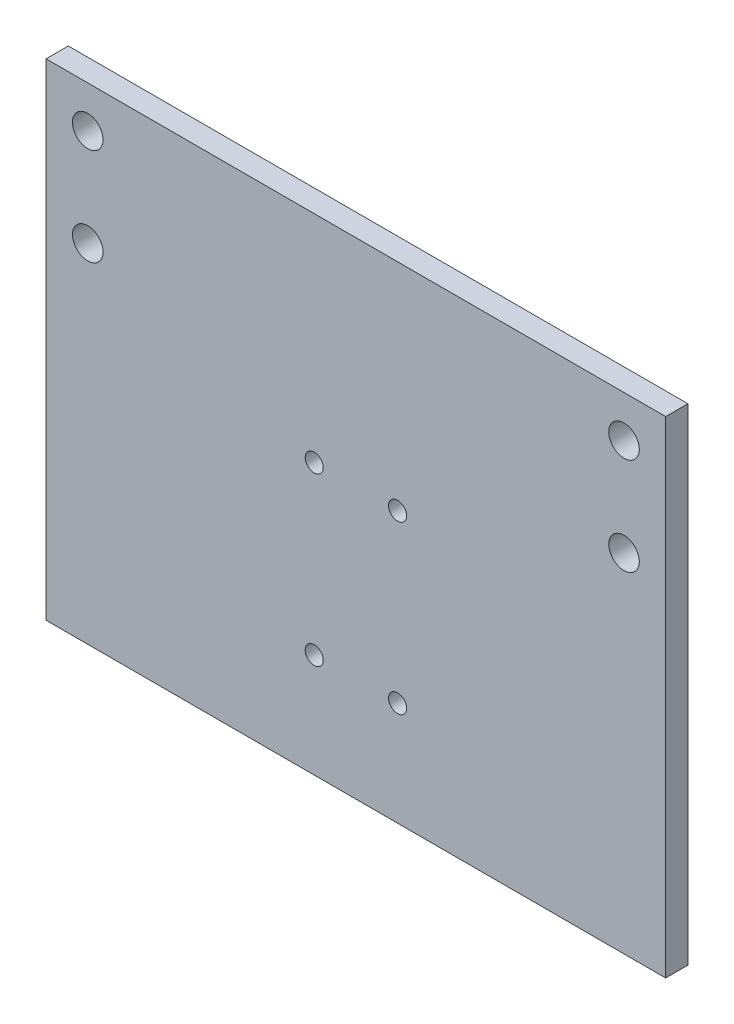
ISO-10303-21;
HEADER;
FILE_DESCRIPTION(('STEP AP214'),'2;1');
FILE_NAME('part.step','',(''),(''),'','','');
FILE_SCHEMA(('AUTOMOTIVE_DESIGN { 1 0 10303 214 1 1 1 1 }'));
ENDSEC;
DATA;
#1=APPLICATION_CONTEXT('core data for automotive mechanical design processes');
#2=APPLICATION_PROTOCOL_DEFINITION('international standard','automotive_design',2000,#1);
#3=PRODUCT_CONTEXT('',#1,'mechanical');
#4=PRODUCT('Part','Part','',(#3));
#5=PRODUCT_RELATED_PRODUCT_CATEGORY('part','',(#4));
#6=PRODUCT_DEFINITION_FORMATION('','',#4);
#7=PRODUCT_DEFINITION_CONTEXT('part definition',#1,'design');
#8=PRODUCT_DEFINITION('design','',#6,#7);
#9=PRODUCT_DEFINITION_SHAPE('','',#8);
#10=(LENGTH_UNIT() NAMED_UNIT(*) SI_UNIT(.MILLI.,.METRE.));
#11=(NAMED_UNIT(*) PLANE_ANGLE_UNIT() SI_UNIT($,.RADIAN.));
#12=(NAMED_UNIT(*) SI_UNIT($,.STERADIAN.) SOLID_ANGLE_UNIT());
#13=UNCERTAINTY_MEASURE_WITH_UNIT(LENGTH_MEASURE(1.E-05),#10,'distance_accuracy_value','');
#14=(GEOMETRIC_REPRESENTATION_CONTEXT(3) GLOBAL_UNCERTAINTY_ASSIGNED_CONTEXT((#13)) GLOBAL_UNIT_ASSIGNED_CONTEXT((#10,
#11,#12)) REPRESENTATION_CONTEXT('',''));
#15=CARTESIAN_POINT('',(0.,0.,0.));
#16=DIRECTION('',(0.,0.,1.));
#17=DIRECTION('',(1.,0.,0.));
#18=AXIS2_PLACEMENT_3D('',#15,#16,#17);
#19=CARTESIAN_POINT('',(111.5,-87.5,-8.));
#20=DIRECTION('',(1.,0.,0.));
#21=DIRECTION('',(0.,1.,0.));
#22=AXIS2_PLACEMENT_3D('',#19,#20,#21);
#23=PLANE('',#22);
#24=DIRECTION('',(0.,1.,0.));
#25=VECTOR('',#24,1.);
#26=CARTESIAN_POINT('',(111.5,-87.5,0.));
#27=LINE('',#26,#25);
#28=CARTESIAN_POINT('',(111.5,-87.5,0.));
#29=VERTEX_POINT('',#28);
#30=CARTESIAN_POINT('',(111.5,87.5,0.));
#31=VERTEX_POINT('',#30);
#32=EDGE_CURVE('E100',#29,#31,#27,.T.);
#33=ORIENTED_EDGE('',*,*,#32,.F.);
#34=DIRECTION('',(0.,0.,1.));
#35=VECTOR('',#34,1.);
#36=CARTESIAN_POINT('',(111.5,-87.5,-8.));
#37=LINE('',#36,#35);
#38=CARTESIAN_POINT('',(111.5,-87.5,-8.));
#39=VERTEX_POINT('',#38);
#40=EDGE_CURVE('E11',#39,#29,#37,.T.);
#41=ORIENTED_EDGE('',*,*,#40,.F.);
#42=DIRECTION('',(0.,1.,0.));
#43=VECTOR('',#42,1.);
#44=CARTESIAN_POINT('',(111.5,-87.5,-8.));
#45=LINE('',#44,#43);
#46=CARTESIAN_POINT('',(111.5,87.5,-8.));
#47=VERTEX_POINT('',#46);
#48=EDGE_CURVE('E93',#39,#47,#45,.T.);
#49=ORIENTED_EDGE('',*,*,#48,.T.);
#50=DIRECTION('',(0.,0.,1.));
#51=VECTOR('',#50,1.);
#52=CARTESIAN_POINT('',(111.5,87.5,-8.));
#53=LINE('',#52,#51);
#54=EDGE_CURVE('E38',#47,#31,#53,.T.);
#55=ORIENTED_EDGE('',*,*,#54,.T.);
#56=EDGE_LOOP('',(#33,#41,#49,#55));
#57=FACE_BOUND('',#56,.T.);
#58=ADVANCED_FACE('F35',(#57),#23,.T.);
#59=CARTESIAN_POINT('',(-111.5,-87.5,-8.));
#60=DIRECTION('',(0.,-1.,0.));
#61=DIRECTION('',(0.,0.,-1.));
#62=AXIS2_PLACEMENT_3D('',#59,#60,#61);
#63=PLANE('',#62);
#64=DIRECTION('',(1.,0.,0.));
#65=VECTOR('',#64,1.);
#66=CARTESIAN_POINT('',(-111.5,-87.5,0.));
#67=LINE('',#66,#65);
#68=CARTESIAN_POINT('',(-111.5,-87.5,0.));
#69=VERTEX_POINT('',#68);
#70=EDGE_CURVE('E95',#69,#29,#67,.T.);
#71=ORIENTED_EDGE('',*,*,#70,.F.);
#72=DIRECTION('',(0.,0.,1.));
#73=VECTOR('',#72,1.);
#74=CARTESIAN_POINT('',(-111.5,-87.5,-8.));
#75=LINE('',#74,#73);
#76=CARTESIAN_POINT('',(-111.5,-87.5,-8.));
#77=VERTEX_POINT('',#76);
#78=EDGE_CURVE('E44',#77,#69,#75,.T.);
#79=ORIENTED_EDGE('',*,*,#78,.F.);
#80=DIRECTION('',(1.,0.,0.));
#81=VECTOR('',#80,1.);
#82=CARTESIAN_POINT('',(-111.5,-87.5,-8.));
#83=LINE('',#82,#81);
#84=EDGE_CURVE('E90',#77,#39,#83,.T.);
#85=ORIENTED_EDGE('',*,*,#84,.T.);
#86=ORIENTED_EDGE('',*,*,#40,.T.);
#87=EDGE_LOOP('',(#71,#79,#85,#86));
#88=FACE_BOUND('',#87,.T.);
#89=ADVANCED_FACE('F111',(#88),#63,.T.);
#90=CARTESIAN_POINT('',(-111.5,-87.5,-8.));
#91=DIRECTION('',(-1.,0.,0.));
#92=DIRECTION('',(0.,0.,1.));
#93=AXIS2_PLACEMENT_3D('',#90,#91,#92);
#94=PLANE('',#93);
#95=DIRECTION('',(0.,-1.,0.));
#96=VECTOR('',#95,1.);
#97=CARTESIAN_POINT('',(-111.5,-87.5,0.));
#98=LINE('',#97,#96);
#99=CARTESIAN_POINT('',(-111.5,87.5,0.));
#100=VERTEX_POINT('',#99);
#101=EDGE_CURVE('E85',#100,#69,#98,.T.);
#102=ORIENTED_EDGE('',*,*,#101,.F.);
#103=DIRECTION('',(0.,0.,1.));
#104=VECTOR('',#103,1.);
#105=CARTESIAN_POINT('',(-111.5,87.5,-8.));
#106=LINE('',#105,#104);
#107=CARTESIAN_POINT('',(-111.5,87.5,-8.));
#108=VERTEX_POINT('',#107);
#109=EDGE_CURVE('E80',#108,#100,#106,.T.);
#110=ORIENTED_EDGE('',*,*,#109,.F.);
#111=DIRECTION('',(0.,-1.,0.));
#112=VECTOR('',#111,1.);
#113=CARTESIAN_POINT('',(-111.5,-87.5,-8.));
#114=LINE('',#113,#112);
#115=EDGE_CURVE('E83',#108,#77,#114,.T.);
#116=ORIENTED_EDGE('',*,*,#115,.T.);
#117=ORIENTED_EDGE('',*,*,#78,.T.);
#118=EDGE_LOOP('',(#102,#110,#116,#117));
#119=FACE_BOUND('',#118,.T.);
#120=ADVANCED_FACE('F82',(#119),#94,.T.);
#121=CARTESIAN_POINT('',(-111.5,87.5,-8.));
#122=DIRECTION('',(0.,1.,0.));
#123=DIRECTION('',(-1.,0.,0.));
#124=AXIS2_PLACEMENT_3D('',#121,#122,#123);
#125=PLANE('',#124);
#126=DIRECTION('',(-1.,0.,0.));
#127=VECTOR('',#126,1.);
#128=CARTESIAN_POINT('',(-111.5,87.5,0.));
#129=LINE('',#128,#127);
#130=EDGE_CURVE('E103',#31,#100,#129,.T.);
#131=ORIENTED_EDGE('',*,*,#130,.F.);
#132=ORIENTED_EDGE('',*,*,#54,.F.);
#133=DIRECTION('',(-1.,0.,0.));
#134=VECTOR('',#133,1.);
#135=CARTESIAN_POINT('',(-111.5,87.5,-8.));
#136=LINE('',#135,#134);
#137=EDGE_CURVE('E89',#47,#108,#136,.T.);
#138=ORIENTED_EDGE('',*,*,#137,.T.);
#139=ORIENTED_EDGE('',*,*,#109,.T.);
#140=EDGE_LOOP('',(#131,#132,#138,#139));
#141=FACE_BOUND('',#140,.T.);
#142=ADVANCED_FACE('F92',(#141),#125,.T.);
#143=CARTESIAN_POINT('',(0.,0.,-8.));
#144=DIRECTION('',(0.,0.,-1.));
#145=DIRECTION('',(-1.,0.,0.));
#146=AXIS2_PLACEMENT_3D('',#143,#144,#145);
#147=PLANE('',#146);
#148=CARTESIAN_POINT('',(96.5,72.5,-8.));
#149=DIRECTION('',(0.,0.,1.));
#150=DIRECTION('',(-1.,0.,0.));
#151=AXIS2_PLACEMENT_3D('',#148,#149,#150);
#152=CIRCLE('',#151,5.5);
#153=CARTESIAN_POINT('',(91.,72.5,-8.));
#154=VERTEX_POINT('',#153);
#155=EDGE_CURVE('E184',#154,#154,#152,.T.);
#156=ORIENTED_EDGE('',*,*,#155,.T.);
#157=EDGE_LOOP('',(#156));
#158=FACE_BOUND('',#157,.T.);
#159=CARTESIAN_POINT('',(96.5,37.5,-8.));
#160=DIRECTION('',(0.,0.,1.));
#161=DIRECTION('',(-1.,0.,0.));
#162=AXIS2_PLACEMENT_3D('',#159,#160,#161);
#163=CIRCLE('',#162,5.5);
#164=CARTESIAN_POINT('',(91.,37.5,-8.));
#165=VERTEX_POINT('',#164);
#166=EDGE_CURVE('E174',#165,#165,#163,.T.);
#167=ORIENTED_EDGE('',*,*,#166,.T.);
#168=EDGE_LOOP('',(#167));
#169=FACE_BOUND('',#168,.T.);
#170=CARTESIAN_POINT('',(-96.5,37.5,-8.));
#171=DIRECTION('',(0.,0.,1.));
#172=DIRECTION('',(1.,0.,0.));
#173=AXIS2_PLACEMENT_3D('',#170,#171,#172);
#174=CIRCLE('',#173,5.5);
#175=CARTESIAN_POINT('',(-91.,37.5,-8.));
#176=VERTEX_POINT('',#175);
#177=EDGE_CURVE('E169',#176,#176,#174,.T.);
#178=ORIENTED_EDGE('',*,*,#177,.T.);
#179=EDGE_LOOP('',(#178));
#180=FACE_BOUND('',#179,.T.);
#181=CARTESIAN_POINT('',(-96.5,72.5,-8.));
#182=DIRECTION('',(0.,0.,1.));
#183=DIRECTION('',(1.,0.,0.));
#184=AXIS2_PLACEMENT_3D('',#181,#182,#183);
#185=CIRCLE('',#184,5.5);
#186=CARTESIAN_POINT('',(-91.,72.5,-8.));
#187=VERTEX_POINT('',#186);
#188=EDGE_CURVE('E189',#187,#187,#185,.T.);
#189=ORIENTED_EDGE('',*,*,#188,.T.);
#190=EDGE_LOOP('',(#189));
#191=FACE_BOUND('',#190,.T.);
#192=CARTESIAN_POINT('',(15.,-50.0999999999999,-8.));
#193=DIRECTION('',(0.,0.,1.));
#194=DIRECTION('',(1.,0.,0.));
#195=AXIS2_PLACEMENT_3D('',#192,#193,#194);
#196=CIRCLE('',#195,3.25);
#197=CARTESIAN_POINT('',(18.25,-50.0999999999999,-8.));
#198=VERTEX_POINT('',#197);
#199=EDGE_CURVE('E195',#198,#198,#196,.T.);
#200=ORIENTED_EDGE('',*,*,#199,.T.);
#201=EDGE_LOOP('',(#200));
#202=FACE_BOUND('',#201,.T.);
#203=CARTESIAN_POINT('',(-15.,-50.0999999999999,-8.));
#204=DIRECTION('',(0.,0.,1.));
#205=DIRECTION('',(1.,0.,0.));
#206=AXIS2_PLACEMENT_3D('',#203,#204,#205);
#207=CIRCLE('',#206,3.25);
#208=CARTESIAN_POINT('',(-11.75,-50.0999999999999,-8.));
#209=VERTEX_POINT('',#208);
#210=EDGE_CURVE('E201',#209,#209,#207,.T.);
#211=ORIENTED_EDGE('',*,*,#210,.T.);
#212=EDGE_LOOP('',(#211));
#213=FACE_BOUND('',#212,.T.);
#214=CARTESIAN_POINT('',(-15.,9.90000000000006,-8.));
#215=DIRECTION('',(0.,0.,1.));
#216=DIRECTION('',(1.,0.,0.));
#217=AXIS2_PLACEMENT_3D('',#214,#215,#216);
#218=CIRCLE('',#217,3.25);
#219=CARTESIAN_POINT('',(-11.75,9.90000000000006,-8.));
#220=VERTEX_POINT('',#219);
#221=EDGE_CURVE('E207',#220,#220,#218,.T.);
#222=ORIENTED_EDGE('',*,*,#221,.T.);
#223=EDGE_LOOP('',(#222));
#224=FACE_BOUND('',#223,.T.);
#225=CARTESIAN_POINT('',(15.,9.90000000000006,-8.));
#226=DIRECTION('',(0.,0.,1.));
#227=DIRECTION('',(1.,0.,0.));
#228=AXIS2_PLACEMENT_3D('',#225,#226,#227);
#229=CIRCLE('',#228,3.25);
#230=CARTESIAN_POINT('',(18.25,9.90000000000006,-8.));
#231=VERTEX_POINT('',#230);
#232=EDGE_CURVE('E104',#231,#231,#229,.T.);
#233=ORIENTED_EDGE('',*,*,#232,.T.);
#234=EDGE_LOOP('',(#233));
#235=FACE_BOUND('',#234,.T.);
#236=ORIENTED_EDGE('',*,*,#48,.F.);
#237=ORIENTED_EDGE('',*,*,#84,.F.);
#238=ORIENTED_EDGE('',*,*,#115,.F.);
#239=ORIENTED_EDGE('',*,*,#137,.F.);
#240=EDGE_LOOP('',(#236,#237,#238,#239));
#241=FACE_BOUND('',#240,.T.);
#242=ADVANCED_FACE('F88',(#158,#169,#180,#191,#202,#213,#224,#235,#241),#147,.T.);
#243=CARTESIAN_POINT('',(0.,0.,0.));
#244=DIRECTION('',(0.,0.,-1.));
#245=DIRECTION('',(-1.,0.,0.));
#246=AXIS2_PLACEMENT_3D('',#243,#244,#245);
#247=PLANE('',#246);
#248=CARTESIAN_POINT('',(96.5,72.5,0.));
#249=DIRECTION('',(0.,0.,1.));
#250=DIRECTION('',(-1.,0.,0.));
#251=AXIS2_PLACEMENT_3D('',#248,#249,#250);
#252=CIRCLE('',#251,5.5);
#253=CARTESIAN_POINT('',(91.,72.5,0.));
#254=VERTEX_POINT('',#253);
#255=EDGE_CURVE('E186',#254,#254,#252,.T.);
#256=ORIENTED_EDGE('',*,*,#255,.F.);
#257=EDGE_LOOP('',(#256));
#258=FACE_BOUND('',#257,.T.);
#259=CARTESIAN_POINT('',(96.5,37.5,0.));
#260=DIRECTION('',(0.,0.,1.));
#261=DIRECTION('',(-1.,0.,0.));
#262=AXIS2_PLACEMENT_3D('',#259,#260,#261);
#263=CIRCLE('',#262,5.5);
#264=CARTESIAN_POINT('',(91.,37.5,0.));
#265=VERTEX_POINT('',#264);
#266=EDGE_CURVE('E179',#265,#265,#263,.T.);
#267=ORIENTED_EDGE('',*,*,#266,.F.);
#268=EDGE_LOOP('',(#267));
#269=FACE_BOUND('',#268,.T.);
#270=CARTESIAN_POINT('',(-96.5,37.5,0.));
#271=DIRECTION('',(0.,0.,1.));
#272=DIRECTION('',(1.,0.,0.));
#273=AXIS2_PLACEMENT_3D('',#270,#271,#272);
#274=CIRCLE('',#273,5.5);
#275=CARTESIAN_POINT('',(-91.,37.5,0.));
#276=VERTEX_POINT('',#275);
#277=EDGE_CURVE('E172',#276,#276,#274,.T.);
#278=ORIENTED_EDGE('',*,*,#277,.F.);
#279=EDGE_LOOP('',(#278));
#280=FACE_BOUND('',#279,.T.);
#281=CARTESIAN_POINT('',(-96.5,72.5,0.));
#282=DIRECTION('',(0.,0.,1.));
#283=DIRECTION('',(1.,0.,0.));
#284=AXIS2_PLACEMENT_3D('',#281,#282,#283);
#285=CIRCLE('',#284,5.5);
#286=CARTESIAN_POINT('',(-91.,72.5,0.));
#287=VERTEX_POINT('',#286);
#288=EDGE_CURVE('E176',#287,#287,#285,.T.);
#289=ORIENTED_EDGE('',*,*,#288,.F.);
#290=EDGE_LOOP('',(#289));
#291=FACE_BOUND('',#290,.T.);
#292=CARTESIAN_POINT('',(15.,-50.0999999999999,0.));
#293=DIRECTION('',(0.,0.,1.));
#294=DIRECTION('',(1.,0.,0.));
#295=AXIS2_PLACEMENT_3D('',#292,#293,#294);
#296=CIRCLE('',#295,3.25);
#297=CARTESIAN_POINT('',(18.25,-50.0999999999999,0.));
#298=VERTEX_POINT('',#297);
#299=EDGE_CURVE('E192',#298,#298,#296,.T.);
#300=ORIENTED_EDGE('',*,*,#299,.F.);
#301=EDGE_LOOP('',(#300));
#302=FACE_BOUND('',#301,.T.);
#303=CARTESIAN_POINT('',(-15.,-50.0999999999999,0.));
#304=DIRECTION('',(0.,0.,1.));
#305=DIRECTION('',(1.,0.,0.));
#306=AXIS2_PLACEMENT_3D('',#303,#304,#305);
#307=CIRCLE('',#306,3.25);
#308=CARTESIAN_POINT('',(-11.75,-50.0999999999999,0.));
#309=VERTEX_POINT('',#308);
#310=EDGE_CURVE('E198',#309,#309,#307,.T.);
#311=ORIENTED_EDGE('',*,*,#310,.F.);
#312=EDGE_LOOP('',(#311));
#313=FACE_BOUND('',#312,.T.);
#314=CARTESIAN_POINT('',(-15.,9.90000000000006,0.));
#315=DIRECTION('',(0.,0.,1.));
#316=DIRECTION('',(1.,0.,0.));
#317=AXIS2_PLACEMENT_3D('',#314,#315,#316);
#318=CIRCLE('',#317,3.25);
#319=CARTESIAN_POINT('',(-11.75,9.90000000000006,0.));
#320=VERTEX_POINT('',#319);
#321=EDGE_CURVE('E204',#320,#320,#318,.T.);
#322=ORIENTED_EDGE('',*,*,#321,.F.);
#323=EDGE_LOOP('',(#322));
#324=FACE_BOUND('',#323,.T.);
#325=CARTESIAN_POINT('',(15.,9.90000000000006,0.));
#326=DIRECTION('',(0.,0.,1.));
#327=DIRECTION('',(1.,0.,0.));
#328=AXIS2_PLACEMENT_3D('',#325,#326,#327);
#329=CIRCLE('',#328,3.25);
#330=CARTESIAN_POINT('',(18.25,9.90000000000006,0.));
#331=VERTEX_POINT('',#330);
#332=EDGE_CURVE('E210',#331,#331,#329,.T.);
#333=ORIENTED_EDGE('',*,*,#332,.F.);
#334=EDGE_LOOP('',(#333));
#335=FACE_BOUND('',#334,.T.);
#336=ORIENTED_EDGE('',*,*,#32,.T.);
#337=ORIENTED_EDGE('',*,*,#130,.T.);
#338=ORIENTED_EDGE('',*,*,#101,.T.);
#339=ORIENTED_EDGE('',*,*,#70,.T.);
#340=EDGE_LOOP('',(#336,#337,#338,#339));
#341=FACE_BOUND('',#340,.T.);
#342=ADVANCED_FACE('F110',(#258,#269,#280,#291,#302,#313,#324,#335,#341),#247,.F.);
#343=CARTESIAN_POINT('',(15.,9.90000000000006,-8.));
#344=DIRECTION('',(0.,0.,1.));
#345=DIRECTION('',(1.,0.,0.));
#346=AXIS2_PLACEMENT_3D('',#343,#344,#345);
#347=CYLINDRICAL_SURFACE('',#346,3.25);
#348=ORIENTED_EDGE('',*,*,#232,.F.);
#349=EDGE_LOOP('',(#348));
#350=FACE_BOUND('',#349,.T.);
#351=ORIENTED_EDGE('',*,*,#332,.T.);
#352=EDGE_LOOP('',(#351));
#353=FACE_BOUND('',#352,.T.);
#354=ADVANCED_FACE('F129',(#350,#353),#347,.F.);
#355=CARTESIAN_POINT('',(-15.,9.90000000000006,-8.));
#356=DIRECTION('',(0.,0.,1.));
#357=DIRECTION('',(1.,0.,0.));
#358=AXIS2_PLACEMENT_3D('',#355,#356,#357);
#359=CYLINDRICAL_SURFACE('',#358,3.25);
#360=ORIENTED_EDGE('',*,*,#221,.F.);
#361=EDGE_LOOP('',(#360));
#362=FACE_BOUND('',#361,.T.);
#363=ORIENTED_EDGE('',*,*,#321,.T.);
#364=EDGE_LOOP('',(#363));
#365=FACE_BOUND('',#364,.T.);
#366=ADVANCED_FACE('F136',(#362,#365),#359,.F.);
#367=CARTESIAN_POINT('',(-15.,-50.0999999999999,-8.));
#368=DIRECTION('',(0.,0.,1.));
#369=DIRECTION('',(1.,0.,0.));
#370=AXIS2_PLACEMENT_3D('',#367,#368,#369);
#371=CYLINDRICAL_SURFACE('',#370,3.25);
#372=ORIENTED_EDGE('',*,*,#210,.F.);
#373=EDGE_LOOP('',(#372));
#374=FACE_BOUND('',#373,.T.);
#375=ORIENTED_EDGE('',*,*,#310,.T.);
#376=EDGE_LOOP('',(#375));
#377=FACE_BOUND('',#376,.T.);
#378=ADVANCED_FACE('F140',(#374,#377),#371,.F.);
#379=CARTESIAN_POINT('',(15.,-50.0999999999999,-8.));
#380=DIRECTION('',(0.,0.,1.));
#381=DIRECTION('',(1.,0.,0.));
#382=AXIS2_PLACEMENT_3D('',#379,#380,#381);
#383=CYLINDRICAL_SURFACE('',#382,3.25);
#384=ORIENTED_EDGE('',*,*,#199,.F.);
#385=EDGE_LOOP('',(#384));
#386=FACE_BOUND('',#385,.T.);
#387=ORIENTED_EDGE('',*,*,#299,.T.);
#388=EDGE_LOOP('',(#387));
#389=FACE_BOUND('',#388,.T.);
#390=ADVANCED_FACE('F144',(#386,#389),#383,.F.);
#391=CARTESIAN_POINT('',(-96.5,72.5,-8.));
#392=DIRECTION('',(0.,0.,1.));
#393=DIRECTION('',(1.,0.,0.));
#394=AXIS2_PLACEMENT_3D('',#391,#392,#393);
#395=CYLINDRICAL_SURFACE('',#394,5.5);
#396=ORIENTED_EDGE('',*,*,#188,.F.);
#397=EDGE_LOOP('',(#396));
#398=FACE_BOUND('',#397,.T.);
#399=ORIENTED_EDGE('',*,*,#288,.T.);
#400=EDGE_LOOP('',(#399));
#401=FACE_BOUND('',#400,.T.);
#402=ADVANCED_FACE('F148',(#398,#401),#395,.F.);
#403=CARTESIAN_POINT('',(-96.5,37.5,-8.));
#404=DIRECTION('',(0.,0.,1.));
#405=DIRECTION('',(1.,0.,0.));
#406=AXIS2_PLACEMENT_3D('',#403,#404,#405);
#407=CYLINDRICAL_SURFACE('',#406,5.5);
#408=ORIENTED_EDGE('',*,*,#177,.F.);
#409=EDGE_LOOP('',(#408));
#410=FACE_BOUND('',#409,.T.);
#411=ORIENTED_EDGE('',*,*,#277,.T.);
#412=EDGE_LOOP('',(#411));
#413=FACE_BOUND('',#412,.T.);
#414=ADVANCED_FACE('F152',(#410,#413),#407,.F.);
#415=CARTESIAN_POINT('',(96.5,37.5,-8.));
#416=DIRECTION('',(0.,0.,1.));
#417=DIRECTION('',(1.,0.,0.));
#418=AXIS2_PLACEMENT_3D('',#415,#416,#417);
#419=CYLINDRICAL_SURFACE('',#418,5.5);
#420=ORIENTED_EDGE('',*,*,#166,.F.);
#421=EDGE_LOOP('',(#420));
#422=FACE_BOUND('',#421,.T.);
#423=ORIENTED_EDGE('',*,*,#266,.T.);
#424=EDGE_LOOP('',(#423));
#425=FACE_BOUND('',#424,.T.);
#426=ADVANCED_FACE('F157',(#422,#425),#419,.F.);
#427=CARTESIAN_POINT('',(96.5,72.5,-8.));
#428=DIRECTION('',(0.,0.,1.));
#429=DIRECTION('',(1.,0.,0.));
#430=AXIS2_PLACEMENT_3D('',#427,#428,#429);
#431=CYLINDRICAL_SURFACE('',#430,5.5);
#432=ORIENTED_EDGE('',*,*,#155,.F.);
#433=EDGE_LOOP('',(#432));
#434=FACE_BOUND('',#433,.T.);
#435=ORIENTED_EDGE('',*,*,#255,.T.);
#436=EDGE_LOOP('',(#435));
#437=FACE_BOUND('',#436,.T.);
#438=ADVANCED_FACE('F154',(#434,#437),#431,.F.);
#439=CLOSED_SHELL('',(#58,#89,#120,#142,#242,#342,#354,#366,#378,#390,#402,#414,#426,#438));
#440=MANIFOLD_SOLID_BREP('B2',#439);
#441=ADVANCED_BREP_SHAPE_REPRESENTATION('',(#18,#440),#14);
#442=SHAPE_DEFINITION_REPRESENTATION(#9,#441);
ENDSEC;
END-ISO-10303-21;
